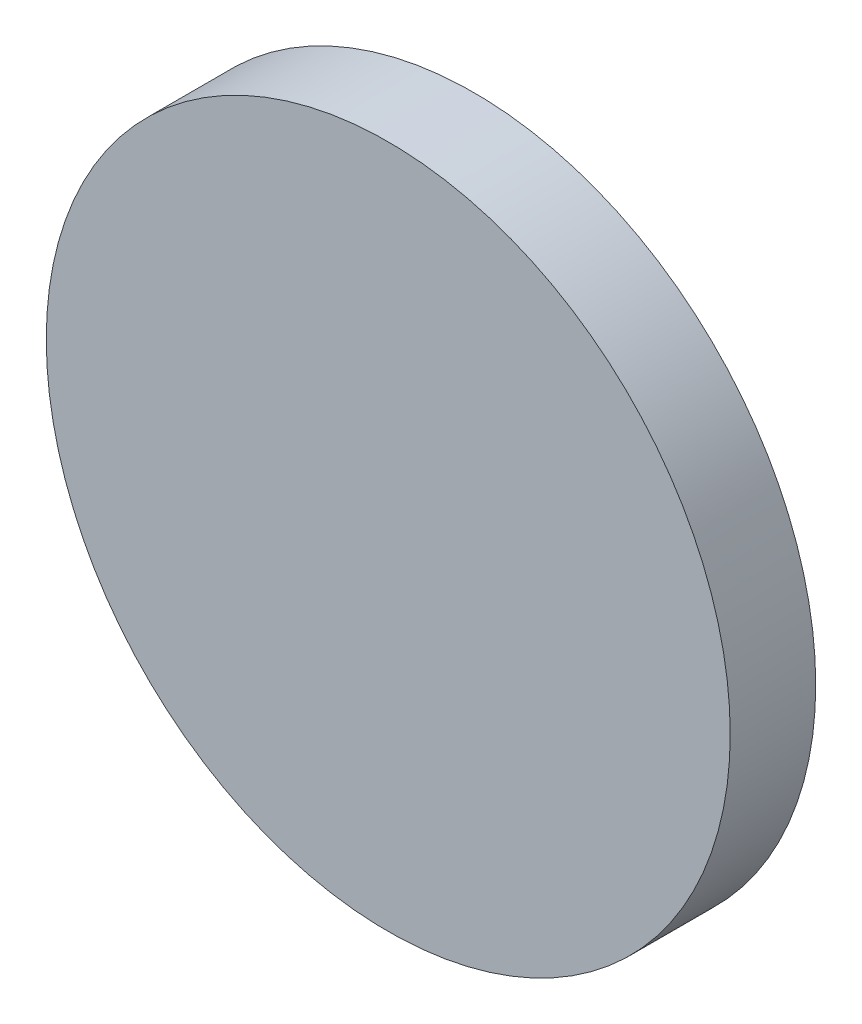
ISO-10303-21;
HEADER;
FILE_DESCRIPTION(('STEP AP214'),'2;1');
FILE_NAME('part.step','',(''),(''),'','','');
FILE_SCHEMA(('AUTOMOTIVE_DESIGN { 1 0 10303 214 1 1 1 1 }'));
ENDSEC;
DATA;
#1=APPLICATION_CONTEXT('core data for automotive mechanical design processes');
#2=APPLICATION_PROTOCOL_DEFINITION('international standard','automotive_design',2000,#1);
#3=PRODUCT_CONTEXT('',#1,'mechanical');
#4=PRODUCT('Part','Part','',(#3));
#5=PRODUCT_RELATED_PRODUCT_CATEGORY('part','',(#4));
#6=PRODUCT_DEFINITION_FORMATION('','',#4);
#7=PRODUCT_DEFINITION_CONTEXT('part definition',#1,'design');
#8=PRODUCT_DEFINITION('design','',#6,#7);
#9=PRODUCT_DEFINITION_SHAPE('','',#8);
#10=(LENGTH_UNIT() NAMED_UNIT(*) SI_UNIT(.MILLI.,.METRE.));
#11=(NAMED_UNIT(*) PLANE_ANGLE_UNIT() SI_UNIT($,.RADIAN.));
#12=(NAMED_UNIT(*) SI_UNIT($,.STERADIAN.) SOLID_ANGLE_UNIT());
#13=UNCERTAINTY_MEASURE_WITH_UNIT(LENGTH_MEASURE(1.E-05),#10,'distance_accuracy_value','');
#14=(GEOMETRIC_REPRESENTATION_CONTEXT(3) GLOBAL_UNCERTAINTY_ASSIGNED_CONTEXT((#13)) GLOBAL_UNIT_ASSIGNED_CONTEXT((#10,
#11,#12)) REPRESENTATION_CONTEXT('',''));
#15=CARTESIAN_POINT('',(0.,0.,0.));
#16=DIRECTION('',(0.,0.,1.));
#17=DIRECTION('',(1.,0.,0.));
#18=AXIS2_PLACEMENT_3D('',#15,#16,#17);
#19=CARTESIAN_POINT('',(0.,0.,5.));
#20=DIRECTION('',(0.,0.,-1.));
#21=DIRECTION('',(-1.,0.,0.));
#22=AXIS2_PLACEMENT_3D('',#19,#20,#21);
#23=CYLINDRICAL_SURFACE('',#22,20.);
#24=CARTESIAN_POINT('',(0.,0.,5.));
#25=DIRECTION('',(0.,0.,1.));
#26=DIRECTION('',(1.,0.,0.));
#27=AXIS2_PLACEMENT_3D('',#24,#25,#26);
#28=CIRCLE('',#27,20.);
#29=CARTESIAN_POINT('',(20.,0.,5.));
#30=VERTEX_POINT('',#29);
#31=EDGE_CURVE('E10',#30,#30,#28,.T.);
#32=ORIENTED_EDGE('',*,*,#31,.F.);
#33=EDGE_LOOP('',(#32));
#34=FACE_BOUND('',#33,.T.);
#35=CARTESIAN_POINT('',(0.,0.,0.));
#36=DIRECTION('',(0.,0.,1.));
#37=DIRECTION('',(1.,0.,0.));
#38=AXIS2_PLACEMENT_3D('',#35,#36,#37);
#39=CIRCLE('',#38,20.);
#40=CARTESIAN_POINT('',(20.,0.,0.));
#41=VERTEX_POINT('',#40);
#42=EDGE_CURVE('E40',#41,#41,#39,.T.);
#43=ORIENTED_EDGE('',*,*,#42,.T.);
#44=EDGE_LOOP('',(#43));
#45=FACE_BOUND('',#44,.T.);
#46=ADVANCED_FACE('F37',(#34,#45),#23,.T.);
#47=CARTESIAN_POINT('',(0.,0.,5.));
#48=DIRECTION('',(0.,0.,1.));
#49=DIRECTION('',(1.,0.,0.));
#50=AXIS2_PLACEMENT_3D('',#47,#48,#49);
#51=PLANE('',#50);
#52=ORIENTED_EDGE('',*,*,#31,.T.);
#53=EDGE_LOOP('',(#52));
#54=FACE_BOUND('',#53,.T.);
#55=ADVANCED_FACE('F52',(#54),#51,.T.);
#56=CARTESIAN_POINT('',(0.,0.,0.));
#57=DIRECTION('',(0.,0.,1.));
#58=DIRECTION('',(1.,0.,0.));
#59=AXIS2_PLACEMENT_3D('',#56,#57,#58);
#60=PLANE('',#59);
#61=ORIENTED_EDGE('',*,*,#42,.F.);
#62=EDGE_LOOP('',(#61));
#63=FACE_BOUND('',#62,.T.);
#64=ADVANCED_FACE('F50',(#63),#60,.F.);
#65=CLOSED_SHELL('',(#46,#55,#64));
#66=MANIFOLD_SOLID_BREP('B2',#65);
#67=ADVANCED_BREP_SHAPE_REPRESENTATION('',(#18,#66),#14);
#68=SHAPE_DEFINITION_REPRESENTATION(#9,#67);
ENDSEC;
END-ISO-10303-21;
